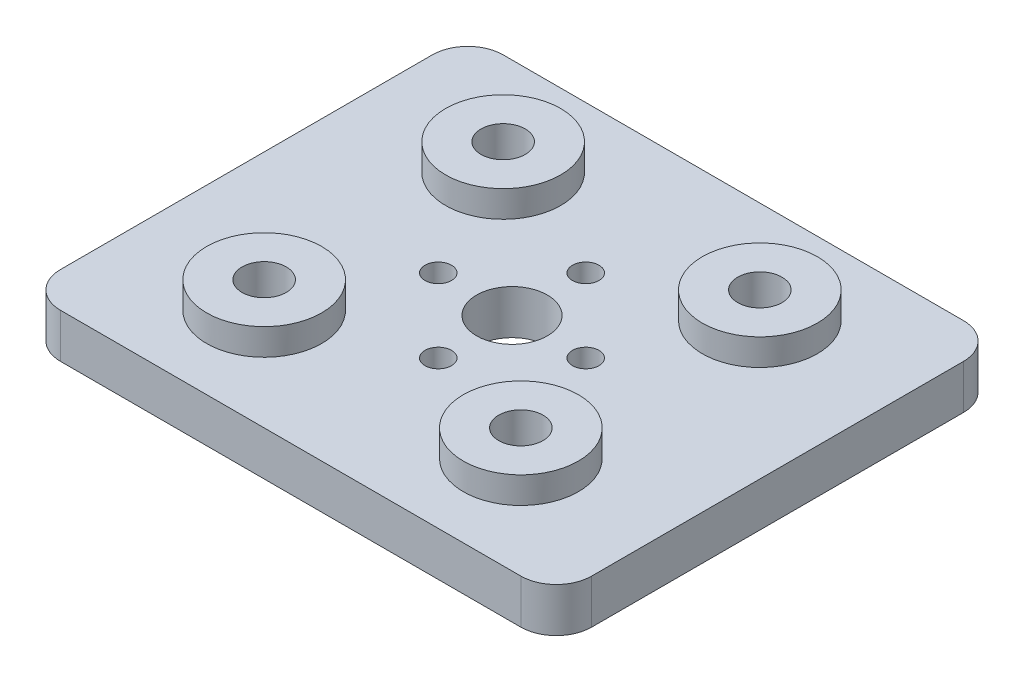
ISO-10303-21;
HEADER;
FILE_DESCRIPTION(('STEP AP214'),'2;1');
FILE_NAME('part.step','',(''),(''),'','','');
FILE_SCHEMA(('AUTOMOTIVE_DESIGN { 1 0 10303 214 1 1 1 1 }'));
ENDSEC;
DATA;
#1=APPLICATION_CONTEXT('core data for automotive mechanical design processes');
#2=APPLICATION_PROTOCOL_DEFINITION('international standard','automotive_design',2000,#1);
#3=PRODUCT_CONTEXT('',#1,'mechanical');
#4=PRODUCT('Part','Part','',(#3));
#5=PRODUCT_RELATED_PRODUCT_CATEGORY('part','',(#4));
#6=PRODUCT_DEFINITION_FORMATION('','',#4);
#7=PRODUCT_DEFINITION_CONTEXT('part definition',#1,'design');
#8=PRODUCT_DEFINITION('design','',#6,#7);
#9=PRODUCT_DEFINITION_SHAPE('','',#8);
#10=(LENGTH_UNIT() NAMED_UNIT(*) SI_UNIT(.MILLI.,.METRE.));
#11=(NAMED_UNIT(*) PLANE_ANGLE_UNIT() SI_UNIT($,.RADIAN.));
#12=(NAMED_UNIT(*) SI_UNIT($,.STERADIAN.) SOLID_ANGLE_UNIT());
#13=UNCERTAINTY_MEASURE_WITH_UNIT(LENGTH_MEASURE(1.E-05),#10,'distance_accuracy_value','');
#14=(GEOMETRIC_REPRESENTATION_CONTEXT(3) GLOBAL_UNCERTAINTY_ASSIGNED_CONTEXT((#13)) GLOBAL_UNIT_ASSIGNED_CONTEXT((#10,
#11,#12)) REPRESENTATION_CONTEXT('',''));
#15=CARTESIAN_POINT('',(0.,0.,0.));
#16=DIRECTION('',(0.,0.,1.));
#17=DIRECTION('',(1.,0.,0.));
#18=AXIS2_PLACEMENT_3D('',#15,#16,#17);
#19=CARTESIAN_POINT('',(0.,5.,0.));
#20=DIRECTION('',(0.,-1.,0.));
#21=DIRECTION('',(0.,0.,-1.));
#22=AXIS2_PLACEMENT_3D('',#19,#20,#21);
#23=PLANE('',#22);
#24=CARTESIAN_POINT('',(4.76814036559839,5.,-16.297796233001));
#25=DIRECTION('',(0.,-1.,0.));
#26=DIRECTION('',(0.,0.,-1.));
#27=AXIS2_PLACEMENT_3D('',#24,#25,#26);
#28=CIRCLE('',#27,6.50000000000001);
#29=CARTESIAN_POINT('',(4.76814036559839,5.,-22.797796233001));
#30=VERTEX_POINT('',#29);
#31=EDGE_CURVE('E40',#30,#30,#28,.F.);
#32=ORIENTED_EDGE('',*,*,#31,.F.);
#33=EDGE_LOOP('',(#32));
#34=FACE_BOUND('',#33,.T.);
#35=CARTESIAN_POINT('',(33.7681403655984,5.,-16.297796233001));
#36=DIRECTION('',(0.,-1.,0.));
#37=DIRECTION('',(0.,0.,-1.));
#38=AXIS2_PLACEMENT_3D('',#35,#36,#37);
#39=CIRCLE('',#38,6.50000000000001);
#40=CARTESIAN_POINT('',(33.7681403655984,5.,-22.797796233001));
#41=VERTEX_POINT('',#40);
#42=EDGE_CURVE('E163',#41,#41,#39,.F.);
#43=ORIENTED_EDGE('',*,*,#42,.F.);
#44=EDGE_LOOP('',(#43));
#45=FACE_BOUND('',#44,.T.);
#46=DIRECTION('',(0.,0.,1.));
#47=VECTOR('',#46,1.);
#48=CARTESIAN_POINT('',(-10.7318596344016,5.,22.2022037669994));
#49=LINE('',#48,#47);
#50=CARTESIAN_POINT('',(-10.7318596344016,5.,-23.7977962330006));
#51=VERTEX_POINT('',#50);
#52=CARTESIAN_POINT('',(-10.7318596344016,5.,18.2022037669994));
#53=VERTEX_POINT('',#52);
#54=EDGE_CURVE('E137',#51,#53,#49,.T.);
#55=ORIENTED_EDGE('',*,*,#54,.T.);
#56=CARTESIAN_POINT('',(-6.73185963440161,5.,18.2022037669994));
#57=DIRECTION('',(0.,-1.,0.));
#58=DIRECTION('',(0.,0.,-1.));
#59=AXIS2_PLACEMENT_3D('',#56,#57,#58);
#60=CIRCLE('',#59,4.);
#61=CARTESIAN_POINT('',(-6.73185963440161,5.,22.2022037669994));
#62=VERTEX_POINT('',#61);
#63=EDGE_CURVE('E152',#53,#62,#60,.F.);
#64=ORIENTED_EDGE('',*,*,#63,.T.);
#65=DIRECTION('',(1.,0.,0.));
#66=VECTOR('',#65,1.);
#67=CARTESIAN_POINT('',(-10.7318596344016,5.,22.2022037669994));
#68=LINE('',#67,#66);
#69=CARTESIAN_POINT('',(45.2681403655984,5.,22.2022037669994));
#70=VERTEX_POINT('',#69);
#71=EDGE_CURVE('E119',#62,#70,#68,.T.);
#72=ORIENTED_EDGE('',*,*,#71,.T.);
#73=CARTESIAN_POINT('',(45.2681403655984,5.,18.2022037669994));
#74=DIRECTION('',(0.,-1.,0.));
#75=DIRECTION('',(0.,0.,-1.));
#76=AXIS2_PLACEMENT_3D('',#73,#74,#75);
#77=CIRCLE('',#76,4.);
#78=CARTESIAN_POINT('',(49.2681403655984,5.,18.2022037669994));
#79=VERTEX_POINT('',#78);
#80=EDGE_CURVE('E150',#70,#79,#77,.F.);
#81=ORIENTED_EDGE('',*,*,#80,.T.);
#82=DIRECTION('',(0.,0.,-1.));
#83=VECTOR('',#82,1.);
#84=CARTESIAN_POINT('',(49.2681403655984,5.,22.2022037669994));
#85=LINE('',#84,#83);
#86=CARTESIAN_POINT('',(49.2681403655984,5.,-23.7977962330006));
#87=VERTEX_POINT('',#86);
#88=EDGE_CURVE('E308',#79,#87,#85,.T.);
#89=ORIENTED_EDGE('',*,*,#88,.T.);
#90=CARTESIAN_POINT('',(45.2681403655984,5.,-23.7977962330006));
#91=DIRECTION('',(0.,-1.,0.));
#92=DIRECTION('',(0.,0.,-1.));
#93=AXIS2_PLACEMENT_3D('',#90,#91,#92);
#94=CIRCLE('',#93,4.);
#95=CARTESIAN_POINT('',(45.2681403655984,5.,-27.7977962330006));
#96=VERTEX_POINT('',#95);
#97=EDGE_CURVE('E54',#87,#96,#94,.F.);
#98=ORIENTED_EDGE('',*,*,#97,.T.);
#99=DIRECTION('',(-1.,0.,0.));
#100=VECTOR('',#99,1.);
#101=CARTESIAN_POINT('',(-10.7318596344016,5.,-27.7977962330006));
#102=LINE('',#101,#100);
#103=CARTESIAN_POINT('',(-6.73185963440161,5.,-27.7977962330006));
#104=VERTEX_POINT('',#103);
#105=EDGE_CURVE('E138',#96,#104,#102,.T.);
#106=ORIENTED_EDGE('',*,*,#105,.T.);
#107=CARTESIAN_POINT('',(-6.73185963440161,5.,-23.7977962330006));
#108=DIRECTION('',(0.,-1.,0.));
#109=DIRECTION('',(0.,0.,-1.));
#110=AXIS2_PLACEMENT_3D('',#107,#108,#109);
#111=CIRCLE('',#110,4.);
#112=EDGE_CURVE('E147',#104,#51,#111,.F.);
#113=ORIENTED_EDGE('',*,*,#112,.T.);
#114=EDGE_LOOP('',(#55,#64,#72,#81,#89,#98,#106,#113));
#115=FACE_BOUND('',#114,.T.);
#116=CARTESIAN_POINT('',(19.2681403655984,5.,-2.79779623300059));
#117=DIRECTION('',(0.,1.,0.));
#118=DIRECTION('',(0.,0.,1.));
#119=AXIS2_PLACEMENT_3D('',#116,#117,#118);
#120=CIRCLE('',#119,4.00000000000001);
#121=CARTESIAN_POINT('',(19.2681403655984,5.,1.20220376699941));
#122=VERTEX_POINT('',#121);
#123=EDGE_CURVE('E132',#122,#122,#120,.T.);
#124=ORIENTED_EDGE('',*,*,#123,.F.);
#125=EDGE_LOOP('',(#124));
#126=FACE_BOUND('',#125,.T.);
#127=CARTESIAN_POINT('',(10.9381403655984,5.,-2.79779623300059));
#128=DIRECTION('',(0.,1.,0.));
#129=DIRECTION('',(0.,0.,1.));
#130=AXIS2_PLACEMENT_3D('',#127,#128,#129);
#131=CIRCLE('',#130,1.5);
#132=CARTESIAN_POINT('',(10.9381403655984,5.,-1.29779623300059));
#133=VERTEX_POINT('',#132);
#134=EDGE_CURVE('E186',#133,#133,#131,.T.);
#135=ORIENTED_EDGE('',*,*,#134,.F.);
#136=EDGE_LOOP('',(#135));
#137=FACE_BOUND('',#136,.T.);
#138=CARTESIAN_POINT('',(19.2681403655984,5.,-11.1277962330006));
#139=DIRECTION('',(0.,1.,0.));
#140=DIRECTION('',(0.,0.,1.));
#141=AXIS2_PLACEMENT_3D('',#138,#139,#140);
#142=CIRCLE('',#141,1.5);
#143=CARTESIAN_POINT('',(19.2681403655984,5.,-9.62779623300059));
#144=VERTEX_POINT('',#143);
#145=EDGE_CURVE('E190',#144,#144,#142,.T.);
#146=ORIENTED_EDGE('',*,*,#145,.F.);
#147=EDGE_LOOP('',(#146));
#148=FACE_BOUND('',#147,.T.);
#149=CARTESIAN_POINT('',(27.5981403655984,5.,-2.79779623300053));
#150=DIRECTION('',(0.,1.,0.));
#151=DIRECTION('',(0.,0.,1.));
#152=AXIS2_PLACEMENT_3D('',#149,#150,#151);
#153=CIRCLE('',#152,1.5);
#154=CARTESIAN_POINT('',(27.5981403655984,5.,-1.29779623300053));
#155=VERTEX_POINT('',#154);
#156=EDGE_CURVE('E194',#155,#155,#153,.T.);
#157=ORIENTED_EDGE('',*,*,#156,.F.);
#158=EDGE_LOOP('',(#157));
#159=FACE_BOUND('',#158,.T.);
#160=CARTESIAN_POINT('',(19.2681403655983,5.,5.53220376699941));
#161=DIRECTION('',(0.,1.,0.));
#162=DIRECTION('',(0.,0.,1.));
#163=AXIS2_PLACEMENT_3D('',#160,#161,#162);
#164=CIRCLE('',#163,1.5);
#165=CARTESIAN_POINT('',(19.2681403655983,5.,7.03220376699941));
#166=VERTEX_POINT('',#165);
#167=EDGE_CURVE('E198',#166,#166,#164,.T.);
#168=ORIENTED_EDGE('',*,*,#167,.F.);
#169=EDGE_LOOP('',(#168));
#170=FACE_BOUND('',#169,.T.);
#171=CARTESIAN_POINT('',(33.7681403655984,5.,10.702203766999));
#172=DIRECTION('',(0.,-1.,0.));
#173=DIRECTION('',(0.,0.,-1.));
#174=AXIS2_PLACEMENT_3D('',#171,#172,#173);
#175=CIRCLE('',#174,6.50000000000001);
#176=CARTESIAN_POINT('',(33.7681403655984,5.,4.20220376699899));
#177=VERTEX_POINT('',#176);
#178=EDGE_CURVE('E166',#177,#177,#175,.F.);
#179=ORIENTED_EDGE('',*,*,#178,.F.);
#180=EDGE_LOOP('',(#179));
#181=FACE_BOUND('',#180,.T.);
#182=CARTESIAN_POINT('',(4.76814036559839,5.,10.702203766999));
#183=DIRECTION('',(0.,-1.,0.));
#184=DIRECTION('',(0.,0.,-1.));
#185=AXIS2_PLACEMENT_3D('',#182,#183,#184);
#186=CIRCLE('',#185,6.50000000000001);
#187=CARTESIAN_POINT('',(4.76814036559839,5.,4.20220376699899));
#188=VERTEX_POINT('',#187);
#189=EDGE_CURVE('E11',#188,#188,#186,.F.);
#190=ORIENTED_EDGE('',*,*,#189,.F.);
#191=EDGE_LOOP('',(#190));
#192=FACE_BOUND('',#191,.T.);
#193=ADVANCED_FACE('F32',(#34,#45,#115,#126,#137,#148,#159,#170,#181,#192),#23,.F.);
#194=CARTESIAN_POINT('',(0.,0.,0.));
#195=DIRECTION('',(0.,-1.,0.));
#196=DIRECTION('',(0.,0.,-1.));
#197=AXIS2_PLACEMENT_3D('',#194,#195,#196);
#198=PLANE('',#197);
#199=CARTESIAN_POINT('',(33.7681403655984,0.,-16.297796233001));
#200=DIRECTION('',(0.,1.,0.));
#201=DIRECTION('',(0.,0.,1.));
#202=AXIS2_PLACEMENT_3D('',#199,#200,#201);
#203=CIRCLE('',#202,2.5);
#204=CARTESIAN_POINT('',(33.7681403655984,0.,-13.797796233001));
#205=VERTEX_POINT('',#204);
#206=EDGE_CURVE('E338',#205,#205,#203,.T.);
#207=ORIENTED_EDGE('',*,*,#206,.T.);
#208=EDGE_LOOP('',(#207));
#209=FACE_BOUND('',#208,.T.);
#210=CARTESIAN_POINT('',(33.7681403655987,0.,10.702203766999));
#211=DIRECTION('',(0.,1.,0.));
#212=DIRECTION('',(0.,0.,1.));
#213=AXIS2_PLACEMENT_3D('',#210,#211,#212);
#214=CIRCLE('',#213,2.5);
#215=CARTESIAN_POINT('',(33.7681403655987,0.,13.202203766999));
#216=VERTEX_POINT('',#215);
#217=EDGE_CURVE('E342',#216,#216,#214,.T.);
#218=ORIENTED_EDGE('',*,*,#217,.T.);
#219=EDGE_LOOP('',(#218));
#220=FACE_BOUND('',#219,.T.);
#221=CARTESIAN_POINT('',(4.76814036559867,0.,10.7022037669994));
#222=DIRECTION('',(0.,1.,0.));
#223=DIRECTION('',(0.,0.,1.));
#224=AXIS2_PLACEMENT_3D('',#221,#222,#223);
#225=CIRCLE('',#224,2.5);
#226=CARTESIAN_POINT('',(4.76814036559867,0.,13.2022037669994));
#227=VERTEX_POINT('',#226);
#228=EDGE_CURVE('E339',#227,#227,#225,.T.);
#229=ORIENTED_EDGE('',*,*,#228,.T.);
#230=EDGE_LOOP('',(#229));
#231=FACE_BOUND('',#230,.T.);
#232=CARTESIAN_POINT('',(4.76814036559839,0.,-16.2977962330006));
#233=DIRECTION('',(0.,1.,0.));
#234=DIRECTION('',(0.,0.,1.));
#235=AXIS2_PLACEMENT_3D('',#232,#233,#234);
#236=CIRCLE('',#235,2.5);
#237=CARTESIAN_POINT('',(4.76814036559839,0.,-13.7977962330006));
#238=VERTEX_POINT('',#237);
#239=EDGE_CURVE('E334',#238,#238,#236,.T.);
#240=ORIENTED_EDGE('',*,*,#239,.T.);
#241=EDGE_LOOP('',(#240));
#242=FACE_BOUND('',#241,.T.);
#243=CARTESIAN_POINT('',(27.5981403655984,0.,-2.79779623300053));
#244=DIRECTION('',(0.,1.,0.));
#245=DIRECTION('',(0.,0.,1.));
#246=AXIS2_PLACEMENT_3D('',#243,#244,#245);
#247=CIRCLE('',#246,1.5);
#248=CARTESIAN_POINT('',(27.5981403655984,0.,-1.29779623300053));
#249=VERTEX_POINT('',#248);
#250=EDGE_CURVE('E327',#249,#249,#247,.T.);
#251=ORIENTED_EDGE('',*,*,#250,.T.);
#252=EDGE_LOOP('',(#251));
#253=FACE_BOUND('',#252,.T.);
#254=CARTESIAN_POINT('',(10.9381403655984,0.,-2.79779623300059));
#255=DIRECTION('',(0.,1.,0.));
#256=DIRECTION('',(0.,0.,1.));
#257=AXIS2_PLACEMENT_3D('',#254,#255,#256);
#258=CIRCLE('',#257,1.5);
#259=CARTESIAN_POINT('',(10.9381403655984,0.,-1.29779623300059));
#260=VERTEX_POINT('',#259);
#261=EDGE_CURVE('E319',#260,#260,#258,.T.);
#262=ORIENTED_EDGE('',*,*,#261,.T.);
#263=EDGE_LOOP('',(#262));
#264=FACE_BOUND('',#263,.T.);
#265=DIRECTION('',(1.,0.,0.));
#266=VECTOR('',#265,1.);
#267=CARTESIAN_POINT('',(-10.7318596344016,0.,22.2022037669994));
#268=LINE('',#267,#266);
#269=CARTESIAN_POINT('',(-6.73185963440161,0.,22.2022037669994));
#270=VERTEX_POINT('',#269);
#271=CARTESIAN_POINT('',(45.2681403655984,0.,22.2022037669994));
#272=VERTEX_POINT('',#271);
#273=EDGE_CURVE('E116',#270,#272,#268,.T.);
#274=ORIENTED_EDGE('',*,*,#273,.F.);
#275=CARTESIAN_POINT('',(-6.73185963440161,0.,18.2022037669994));
#276=DIRECTION('',(0.,-1.,0.));
#277=DIRECTION('',(0.,0.,-1.));
#278=AXIS2_PLACEMENT_3D('',#275,#276,#277);
#279=CIRCLE('',#278,4.);
#280=CARTESIAN_POINT('',(-10.7318596344016,0.,18.2022037669994));
#281=VERTEX_POINT('',#280);
#282=EDGE_CURVE('E99',#270,#281,#279,.T.);
#283=ORIENTED_EDGE('',*,*,#282,.T.);
#284=DIRECTION('',(0.,0.,1.));
#285=VECTOR('',#284,1.);
#286=CARTESIAN_POINT('',(-10.7318596344016,0.,22.2022037669994));
#287=LINE('',#286,#285);
#288=CARTESIAN_POINT('',(-10.7318596344016,0.,-23.7977962330006));
#289=VERTEX_POINT('',#288);
#290=EDGE_CURVE('E127',#289,#281,#287,.T.);
#291=ORIENTED_EDGE('',*,*,#290,.F.);
#292=CARTESIAN_POINT('',(-6.73185963440161,0.,-23.7977962330006));
#293=DIRECTION('',(0.,-1.,0.));
#294=DIRECTION('',(0.,0.,-1.));
#295=AXIS2_PLACEMENT_3D('',#292,#293,#294);
#296=CIRCLE('',#295,4.);
#297=CARTESIAN_POINT('',(-6.73185963440161,0.,-27.7977962330006));
#298=VERTEX_POINT('',#297);
#299=EDGE_CURVE('E120',#289,#298,#296,.T.);
#300=ORIENTED_EDGE('',*,*,#299,.T.);
#301=DIRECTION('',(-1.,0.,0.));
#302=VECTOR('',#301,1.);
#303=CARTESIAN_POINT('',(-10.7318596344016,0.,-27.7977962330006));
#304=LINE('',#303,#302);
#305=CARTESIAN_POINT('',(45.2681403655984,0.,-27.7977962330006));
#306=VERTEX_POINT('',#305);
#307=EDGE_CURVE('E130',#306,#298,#304,.T.);
#308=ORIENTED_EDGE('',*,*,#307,.F.);
#309=CARTESIAN_POINT('',(45.2681403655984,0.,-23.7977962330006));
#310=DIRECTION('',(0.,-1.,0.));
#311=DIRECTION('',(0.,0.,-1.));
#312=AXIS2_PLACEMENT_3D('',#309,#310,#311);
#313=CIRCLE('',#312,4.);
#314=CARTESIAN_POINT('',(49.2681403655984,0.,-23.7977962330006));
#315=VERTEX_POINT('',#314);
#316=EDGE_CURVE('E141',#306,#315,#313,.T.);
#317=ORIENTED_EDGE('',*,*,#316,.T.);
#318=DIRECTION('',(0.,0.,-1.));
#319=VECTOR('',#318,1.);
#320=CARTESIAN_POINT('',(49.2681403655984,0.,22.2022037669994));
#321=LINE('',#320,#319);
#322=CARTESIAN_POINT('',(49.2681403655984,0.,18.2022037669994));
#323=VERTEX_POINT('',#322);
#324=EDGE_CURVE('E126',#323,#315,#321,.T.);
#325=ORIENTED_EDGE('',*,*,#324,.F.);
#326=CARTESIAN_POINT('',(45.2681403655984,0.,18.2022037669994));
#327=DIRECTION('',(0.,-1.,0.));
#328=DIRECTION('',(0.,0.,-1.));
#329=AXIS2_PLACEMENT_3D('',#326,#327,#328);
#330=CIRCLE('',#329,4.);
#331=EDGE_CURVE('E110',#323,#272,#330,.T.);
#332=ORIENTED_EDGE('',*,*,#331,.T.);
#333=EDGE_LOOP('',(#274,#283,#291,#300,#308,#317,#325,#332));
#334=FACE_BOUND('',#333,.T.);
#335=CARTESIAN_POINT('',(19.2681403655984,0.,-2.79779623300059));
#336=DIRECTION('',(0.,1.,0.));
#337=DIRECTION('',(0.,0.,1.));
#338=AXIS2_PLACEMENT_3D('',#335,#336,#337);
#339=CIRCLE('',#338,4.00000000000001);
#340=CARTESIAN_POINT('',(19.2681403655984,0.,1.20220376699941));
#341=VERTEX_POINT('',#340);
#342=EDGE_CURVE('E311',#341,#341,#339,.T.);
#343=ORIENTED_EDGE('',*,*,#342,.T.);
#344=EDGE_LOOP('',(#343));
#345=FACE_BOUND('',#344,.T.);
#346=CARTESIAN_POINT('',(19.2681403655984,0.,-11.1277962330006));
#347=DIRECTION('',(0.,1.,0.));
#348=DIRECTION('',(0.,0.,1.));
#349=AXIS2_PLACEMENT_3D('',#346,#347,#348);
#350=CIRCLE('',#349,1.5);
#351=CARTESIAN_POINT('',(19.2681403655984,0.,-9.62779623300059));
#352=VERTEX_POINT('',#351);
#353=EDGE_CURVE('E323',#352,#352,#350,.T.);
#354=ORIENTED_EDGE('',*,*,#353,.T.);
#355=EDGE_LOOP('',(#354));
#356=FACE_BOUND('',#355,.T.);
#357=CARTESIAN_POINT('',(19.2681403655983,0.,5.53220376699941));
#358=DIRECTION('',(0.,1.,0.));
#359=DIRECTION('',(0.,0.,1.));
#360=AXIS2_PLACEMENT_3D('',#357,#358,#359);
#361=CIRCLE('',#360,1.5);
#362=CARTESIAN_POINT('',(19.2681403655983,0.,7.03220376699941));
#363=VERTEX_POINT('',#362);
#364=EDGE_CURVE('E331',#363,#363,#361,.T.);
#365=ORIENTED_EDGE('',*,*,#364,.T.);
#366=EDGE_LOOP('',(#365));
#367=FACE_BOUND('',#366,.T.);
#368=ADVANCED_FACE('F123',(#209,#220,#231,#242,#253,#264,#334,#345,#356,#367),#198,.T.);
#369=CARTESIAN_POINT('',(-10.7318596344016,5.,22.2022037669994));
#370=DIRECTION('',(1.,0.,0.));
#371=DIRECTION('',(0.,0.,-1.));
#372=AXIS2_PLACEMENT_3D('',#369,#370,#371);
#373=PLANE('',#372);
#374=ORIENTED_EDGE('',*,*,#290,.T.);
#375=DIRECTION('',(0.,-1.,0.));
#376=VECTOR('',#375,1.);
#377=CARTESIAN_POINT('',(-10.7318596344016,5.,18.2022037669994));
#378=LINE('',#377,#376);
#379=EDGE_CURVE('E104',#281,#53,#378,.F.);
#380=ORIENTED_EDGE('',*,*,#379,.T.);
#381=ORIENTED_EDGE('',*,*,#54,.F.);
#382=DIRECTION('',(0.,-1.,0.));
#383=VECTOR('',#382,1.);
#384=CARTESIAN_POINT('',(-10.7318596344016,5.,-23.7977962330006));
#385=LINE('',#384,#383);
#386=EDGE_CURVE('E109',#51,#289,#385,.T.);
#387=ORIENTED_EDGE('',*,*,#386,.T.);
#388=EDGE_LOOP('',(#374,#380,#381,#387));
#389=FACE_BOUND('',#388,.T.);
#390=ADVANCED_FACE('F277',(#389),#373,.F.);
#391=CARTESIAN_POINT('',(-10.7318596344016,5.,22.2022037669994));
#392=DIRECTION('',(0.,0.,-1.));
#393=DIRECTION('',(-1.,0.,0.));
#394=AXIS2_PLACEMENT_3D('',#391,#392,#393);
#395=PLANE('',#394);
#396=ORIENTED_EDGE('',*,*,#71,.F.);
#397=DIRECTION('',(0.,-1.,0.));
#398=VECTOR('',#397,1.);
#399=CARTESIAN_POINT('',(-6.73185963440161,5.,22.2022037669994));
#400=LINE('',#399,#398);
#401=EDGE_CURVE('E103',#62,#270,#400,.T.);
#402=ORIENTED_EDGE('',*,*,#401,.T.);
#403=ORIENTED_EDGE('',*,*,#273,.T.);
#404=DIRECTION('',(0.,-1.,0.));
#405=VECTOR('',#404,1.);
#406=CARTESIAN_POINT('',(45.2681403655984,5.,22.2022037669994));
#407=LINE('',#406,#405);
#408=EDGE_CURVE('E121',#272,#70,#407,.F.);
#409=ORIENTED_EDGE('',*,*,#408,.T.);
#410=EDGE_LOOP('',(#396,#402,#403,#409));
#411=FACE_BOUND('',#410,.T.);
#412=ADVANCED_FACE('F115',(#411),#395,.F.);
#413=CARTESIAN_POINT('',(49.2681403655984,5.,22.2022037669994));
#414=DIRECTION('',(-1.,0.,0.));
#415=DIRECTION('',(0.,0.,1.));
#416=AXIS2_PLACEMENT_3D('',#413,#414,#415);
#417=PLANE('',#416);
#418=ORIENTED_EDGE('',*,*,#88,.F.);
#419=DIRECTION('',(0.,-1.,0.));
#420=VECTOR('',#419,1.);
#421=CARTESIAN_POINT('',(49.2681403655984,5.,18.2022037669994));
#422=LINE('',#421,#420);
#423=EDGE_CURVE('E156',#79,#323,#422,.T.);
#424=ORIENTED_EDGE('',*,*,#423,.T.);
#425=ORIENTED_EDGE('',*,*,#324,.T.);
#426=DIRECTION('',(0.,-1.,0.));
#427=VECTOR('',#426,1.);
#428=CARTESIAN_POINT('',(49.2681403655984,5.,-23.7977962330006));
#429=LINE('',#428,#427);
#430=EDGE_CURVE('E154',#315,#87,#429,.F.);
#431=ORIENTED_EDGE('',*,*,#430,.T.);
#432=EDGE_LOOP('',(#418,#424,#425,#431));
#433=FACE_BOUND('',#432,.T.);
#434=ADVANCED_FACE('F281',(#433),#417,.F.);
#435=CARTESIAN_POINT('',(-10.7318596344016,5.,-27.7977962330006));
#436=DIRECTION('',(0.,0.,1.));
#437=DIRECTION('',(1.,0.,0.));
#438=AXIS2_PLACEMENT_3D('',#435,#436,#437);
#439=PLANE('',#438);
#440=ORIENTED_EDGE('',*,*,#105,.F.);
#441=DIRECTION('',(0.,-1.,0.));
#442=VECTOR('',#441,1.);
#443=CARTESIAN_POINT('',(45.2681403655984,5.,-27.7977962330006));
#444=LINE('',#443,#442);
#445=EDGE_CURVE('E160',#96,#306,#444,.T.);
#446=ORIENTED_EDGE('',*,*,#445,.T.);
#447=ORIENTED_EDGE('',*,*,#307,.T.);
#448=DIRECTION('',(0.,-1.,0.));
#449=VECTOR('',#448,1.);
#450=CARTESIAN_POINT('',(-6.73185963440161,5.,-27.7977962330006));
#451=LINE('',#450,#449);
#452=EDGE_CURVE('E47',#298,#104,#451,.F.);
#453=ORIENTED_EDGE('',*,*,#452,.T.);
#454=EDGE_LOOP('',(#440,#446,#447,#453));
#455=FACE_BOUND('',#454,.T.);
#456=ADVANCED_FACE('F272',(#455),#439,.F.);
#457=CARTESIAN_POINT('',(19.2681403655984,5.,-2.79779623300059));
#458=DIRECTION('',(0.,-1.,0.));
#459=DIRECTION('',(0.,0.,-1.));
#460=AXIS2_PLACEMENT_3D('',#457,#458,#459);
#461=CYLINDRICAL_SURFACE('',#460,4.00000000000001);
#462=ORIENTED_EDGE('',*,*,#123,.T.);
#463=EDGE_LOOP('',(#462));
#464=FACE_BOUND('',#463,.T.);
#465=ORIENTED_EDGE('',*,*,#342,.F.);
#466=EDGE_LOOP('',(#465));
#467=FACE_BOUND('',#466,.T.);
#468=ADVANCED_FACE('F269',(#464,#467),#461,.F.);
#469=CARTESIAN_POINT('',(10.9381403655984,5.,-2.79779623300059));
#470=DIRECTION('',(0.,-1.,0.));
#471=DIRECTION('',(0.,0.,-1.));
#472=AXIS2_PLACEMENT_3D('',#469,#470,#471);
#473=CYLINDRICAL_SURFACE('',#472,1.5);
#474=ORIENTED_EDGE('',*,*,#134,.T.);
#475=EDGE_LOOP('',(#474));
#476=FACE_BOUND('',#475,.T.);
#477=ORIENTED_EDGE('',*,*,#261,.F.);
#478=EDGE_LOOP('',(#477));
#479=FACE_BOUND('',#478,.T.);
#480=ADVANCED_FACE('F265',(#476,#479),#473,.F.);
#481=CARTESIAN_POINT('',(19.2681403655984,5.,-11.1277962330006));
#482=DIRECTION('',(0.,-1.,0.));
#483=DIRECTION('',(0.,0.,-1.));
#484=AXIS2_PLACEMENT_3D('',#481,#482,#483);
#485=CYLINDRICAL_SURFACE('',#484,1.5);
#486=ORIENTED_EDGE('',*,*,#145,.T.);
#487=EDGE_LOOP('',(#486));
#488=FACE_BOUND('',#487,.T.);
#489=ORIENTED_EDGE('',*,*,#353,.F.);
#490=EDGE_LOOP('',(#489));
#491=FACE_BOUND('',#490,.T.);
#492=ADVANCED_FACE('F261',(#488,#491),#485,.F.);
#493=CARTESIAN_POINT('',(27.5981403655984,5.,-2.79779623300053));
#494=DIRECTION('',(0.,-1.,0.));
#495=DIRECTION('',(0.,0.,-1.));
#496=AXIS2_PLACEMENT_3D('',#493,#494,#495);
#497=CYLINDRICAL_SURFACE('',#496,1.5);
#498=ORIENTED_EDGE('',*,*,#156,.T.);
#499=EDGE_LOOP('',(#498));
#500=FACE_BOUND('',#499,.T.);
#501=ORIENTED_EDGE('',*,*,#250,.F.);
#502=EDGE_LOOP('',(#501));
#503=FACE_BOUND('',#502,.T.);
#504=ADVANCED_FACE('F257',(#500,#503),#497,.F.);
#505=CARTESIAN_POINT('',(19.2681403655983,5.,5.53220376699941));
#506=DIRECTION('',(0.,-1.,0.));
#507=DIRECTION('',(0.,0.,-1.));
#508=AXIS2_PLACEMENT_3D('',#505,#506,#507);
#509=CYLINDRICAL_SURFACE('',#508,1.5);
#510=ORIENTED_EDGE('',*,*,#167,.T.);
#511=EDGE_LOOP('',(#510));
#512=FACE_BOUND('',#511,.T.);
#513=ORIENTED_EDGE('',*,*,#364,.F.);
#514=EDGE_LOOP('',(#513));
#515=FACE_BOUND('',#514,.T.);
#516=ADVANCED_FACE('F253',(#512,#515),#509,.F.);
#517=CARTESIAN_POINT('',(4.76814036559839,0.,-16.2977962330006));
#518=DIRECTION('',(0.,1.,0.));
#519=DIRECTION('',(0.,0.,1.));
#520=AXIS2_PLACEMENT_3D('',#517,#518,#519);
#521=CYLINDRICAL_SURFACE('',#520,2.5);
#522=ORIENTED_EDGE('',*,*,#239,.F.);
#523=EDGE_LOOP('',(#522));
#524=FACE_BOUND('',#523,.T.);
#525=CARTESIAN_POINT('',(4.76814036559839,8.,-16.297796233001));
#526=DIRECTION('',(0.,1.,0.));
#527=DIRECTION('',(0.,0.,1.));
#528=AXIS2_PLACEMENT_3D('',#525,#526,#527);
#529=CIRCLE('',#528,2.5);
#530=CARTESIAN_POINT('',(4.76814036559839,8.,-13.797796233001));
#531=VERTEX_POINT('',#530);
#532=EDGE_CURVE('E362',#531,#531,#529,.T.);
#533=ORIENTED_EDGE('',*,*,#532,.T.);
#534=EDGE_LOOP('',(#533));
#535=FACE_BOUND('',#534,.T.);
#536=ADVANCED_FACE('F249',(#524,#535),#521,.F.);
#537=CARTESIAN_POINT('',(4.76814036559867,0.,10.7022037669994));
#538=DIRECTION('',(0.,1.,0.));
#539=DIRECTION('',(0.,0.,1.));
#540=AXIS2_PLACEMENT_3D('',#537,#538,#539);
#541=CYLINDRICAL_SURFACE('',#540,2.5);
#542=ORIENTED_EDGE('',*,*,#228,.F.);
#543=EDGE_LOOP('',(#542));
#544=FACE_BOUND('',#543,.T.);
#545=CARTESIAN_POINT('',(4.76814036559839,8.,10.702203766999));
#546=DIRECTION('',(0.,1.,0.));
#547=DIRECTION('',(0.,0.,1.));
#548=AXIS2_PLACEMENT_3D('',#545,#546,#547);
#549=CIRCLE('',#548,2.5);
#550=CARTESIAN_POINT('',(4.76814036559839,8.,13.202203766999));
#551=VERTEX_POINT('',#550);
#552=EDGE_CURVE('E368',#551,#551,#549,.T.);
#553=ORIENTED_EDGE('',*,*,#552,.T.);
#554=EDGE_LOOP('',(#553));
#555=FACE_BOUND('',#554,.T.);
#556=ADVANCED_FACE('F245',(#544,#555),#541,.F.);
#557=CARTESIAN_POINT('',(33.7681403655987,0.,10.702203766999));
#558=DIRECTION('',(0.,1.,0.));
#559=DIRECTION('',(0.,0.,1.));
#560=AXIS2_PLACEMENT_3D('',#557,#558,#559);
#561=CYLINDRICAL_SURFACE('',#560,2.5);
#562=ORIENTED_EDGE('',*,*,#217,.F.);
#563=EDGE_LOOP('',(#562));
#564=FACE_BOUND('',#563,.T.);
#565=CARTESIAN_POINT('',(33.7681403655984,8.,10.702203766999));
#566=DIRECTION('',(0.,1.,0.));
#567=DIRECTION('',(0.,0.,1.));
#568=AXIS2_PLACEMENT_3D('',#565,#566,#567);
#569=CIRCLE('',#568,2.5);
#570=CARTESIAN_POINT('',(33.7681403655984,8.,13.202203766999));
#571=VERTEX_POINT('',#570);
#572=EDGE_CURVE('E356',#571,#571,#569,.T.);
#573=ORIENTED_EDGE('',*,*,#572,.T.);
#574=EDGE_LOOP('',(#573));
#575=FACE_BOUND('',#574,.T.);
#576=ADVANCED_FACE('F241',(#564,#575),#561,.F.);
#577=CARTESIAN_POINT('',(33.7681403655984,0.,-16.297796233001));
#578=DIRECTION('',(0.,1.,0.));
#579=DIRECTION('',(0.,0.,1.));
#580=AXIS2_PLACEMENT_3D('',#577,#578,#579);
#581=CYLINDRICAL_SURFACE('',#580,2.5);
#582=ORIENTED_EDGE('',*,*,#206,.F.);
#583=EDGE_LOOP('',(#582));
#584=FACE_BOUND('',#583,.T.);
#585=CARTESIAN_POINT('',(33.7681403655984,8.,-16.297796233001));
#586=DIRECTION('',(0.,1.,0.));
#587=DIRECTION('',(0.,0.,1.));
#588=AXIS2_PLACEMENT_3D('',#585,#586,#587);
#589=CIRCLE('',#588,2.5);
#590=CARTESIAN_POINT('',(33.7681403655984,8.,-13.797796233001));
#591=VERTEX_POINT('',#590);
#592=EDGE_CURVE('E350',#591,#591,#589,.T.);
#593=ORIENTED_EDGE('',*,*,#592,.T.);
#594=EDGE_LOOP('',(#593));
#595=FACE_BOUND('',#594,.T.);
#596=ADVANCED_FACE('F238',(#584,#595),#581,.F.);
#597=CARTESIAN_POINT('',(-6.73185963440161,5.,18.2022037669994));
#598=DIRECTION('',(0.,-1.,0.));
#599=DIRECTION('',(0.,0.,-1.));
#600=AXIS2_PLACEMENT_3D('',#597,#598,#599);
#601=CYLINDRICAL_SURFACE('',#600,4.);
#602=ORIENTED_EDGE('',*,*,#63,.F.);
#603=ORIENTED_EDGE('',*,*,#379,.F.);
#604=ORIENTED_EDGE('',*,*,#282,.F.);
#605=ORIENTED_EDGE('',*,*,#401,.F.);
#606=EDGE_LOOP('',(#602,#603,#604,#605));
#607=FACE_BOUND('',#606,.T.);
#608=ADVANCED_FACE('F102',(#607),#601,.T.);
#609=CARTESIAN_POINT('',(45.2681403655984,5.,18.2022037669994));
#610=DIRECTION('',(0.,-1.,0.));
#611=DIRECTION('',(0.,0.,-1.));
#612=AXIS2_PLACEMENT_3D('',#609,#610,#611);
#613=CYLINDRICAL_SURFACE('',#612,4.);
#614=ORIENTED_EDGE('',*,*,#80,.F.);
#615=ORIENTED_EDGE('',*,*,#408,.F.);
#616=ORIENTED_EDGE('',*,*,#331,.F.);
#617=ORIENTED_EDGE('',*,*,#423,.F.);
#618=EDGE_LOOP('',(#614,#615,#616,#617));
#619=FACE_BOUND('',#618,.T.);
#620=ADVANCED_FACE('F292',(#619),#613,.T.);
#621=CARTESIAN_POINT('',(45.2681403655984,5.,-23.7977962330006));
#622=DIRECTION('',(0.,-1.,0.));
#623=DIRECTION('',(0.,0.,-1.));
#624=AXIS2_PLACEMENT_3D('',#621,#622,#623);
#625=CYLINDRICAL_SURFACE('',#624,4.);
#626=ORIENTED_EDGE('',*,*,#97,.F.);
#627=ORIENTED_EDGE('',*,*,#430,.F.);
#628=ORIENTED_EDGE('',*,*,#316,.F.);
#629=ORIENTED_EDGE('',*,*,#445,.F.);
#630=EDGE_LOOP('',(#626,#627,#628,#629));
#631=FACE_BOUND('',#630,.T.);
#632=ADVANCED_FACE('F294',(#631),#625,.T.);
#633=CARTESIAN_POINT('',(-6.73185963440161,5.,-23.7977962330006));
#634=DIRECTION('',(0.,-1.,0.));
#635=DIRECTION('',(0.,0.,-1.));
#636=AXIS2_PLACEMENT_3D('',#633,#634,#635);
#637=CYLINDRICAL_SURFACE('',#636,4.);
#638=ORIENTED_EDGE('',*,*,#112,.F.);
#639=ORIENTED_EDGE('',*,*,#452,.F.);
#640=ORIENTED_EDGE('',*,*,#299,.F.);
#641=ORIENTED_EDGE('',*,*,#386,.F.);
#642=EDGE_LOOP('',(#638,#639,#640,#641));
#643=FACE_BOUND('',#642,.T.);
#644=ADVANCED_FACE('F34',(#643),#637,.T.);
#645=CARTESIAN_POINT('',(33.7681403655984,8.,-16.297796233001));
#646=DIRECTION('',(0.,1.,0.));
#647=DIRECTION('',(0.,0.,1.));
#648=AXIS2_PLACEMENT_3D('',#645,#646,#647);
#649=PLANE('',#648);
#650=CARTESIAN_POINT('',(33.7681403655984,8.,-16.297796233001));
#651=DIRECTION('',(0.,1.,0.));
#652=DIRECTION('',(0.,0.,1.));
#653=AXIS2_PLACEMENT_3D('',#650,#651,#652);
#654=CIRCLE('',#653,6.50000000000001);
#655=CARTESIAN_POINT('',(33.7681403655984,8.,-9.79779623300099));
#656=VERTEX_POINT('',#655);
#657=EDGE_CURVE('E343',#656,#656,#654,.T.);
#658=ORIENTED_EDGE('',*,*,#657,.T.);
#659=EDGE_LOOP('',(#658));
#660=FACE_BOUND('',#659,.T.);
#661=ORIENTED_EDGE('',*,*,#592,.F.);
#662=EDGE_LOOP('',(#661));
#663=FACE_BOUND('',#662,.T.);
#664=ADVANCED_FACE('F231',(#660,#663),#649,.T.);
#665=CARTESIAN_POINT('',(33.7681403655984,8.,-16.297796233001));
#666=DIRECTION('',(0.,-1.,0.));
#667=DIRECTION('',(0.,0.,-1.));
#668=AXIS2_PLACEMENT_3D('',#665,#666,#667);
#669=CYLINDRICAL_SURFACE('',#668,6.50000000000001);
#670=ORIENTED_EDGE('',*,*,#657,.F.);
#671=EDGE_LOOP('',(#670));
#672=FACE_BOUND('',#671,.T.);
#673=ORIENTED_EDGE('',*,*,#42,.T.);
#674=EDGE_LOOP('',(#673));
#675=FACE_BOUND('',#674,.T.);
#676=ADVANCED_FACE('F226',(#672,#675),#669,.T.);
#677=CARTESIAN_POINT('',(33.7681403655984,8.,10.702203766999));
#678=DIRECTION('',(0.,1.,0.));
#679=DIRECTION('',(0.,0.,1.));
#680=AXIS2_PLACEMENT_3D('',#677,#678,#679);
#681=PLANE('',#680);
#682=CARTESIAN_POINT('',(33.7681403655984,8.,10.702203766999));
#683=DIRECTION('',(0.,1.,0.));
#684=DIRECTION('',(0.,0.,1.));
#685=AXIS2_PLACEMENT_3D('',#682,#683,#684);
#686=CIRCLE('',#685,6.50000000000001);
#687=CARTESIAN_POINT('',(33.7681403655984,8.,17.202203766999));
#688=VERTEX_POINT('',#687);
#689=EDGE_CURVE('E353',#688,#688,#686,.T.);
#690=ORIENTED_EDGE('',*,*,#689,.T.);
#691=EDGE_LOOP('',(#690));
#692=FACE_BOUND('',#691,.T.);
#693=ORIENTED_EDGE('',*,*,#572,.F.);
#694=EDGE_LOOP('',(#693));
#695=FACE_BOUND('',#694,.T.);
#696=ADVANCED_FACE('F223',(#692,#695),#681,.T.);
#697=CARTESIAN_POINT('',(33.7681403655984,8.,10.702203766999));
#698=DIRECTION('',(0.,-1.,0.));
#699=DIRECTION('',(0.,0.,-1.));
#700=AXIS2_PLACEMENT_3D('',#697,#698,#699);
#701=CYLINDRICAL_SURFACE('',#700,6.50000000000001);
#702=ORIENTED_EDGE('',*,*,#689,.F.);
#703=EDGE_LOOP('',(#702));
#704=FACE_BOUND('',#703,.T.);
#705=ORIENTED_EDGE('',*,*,#178,.T.);
#706=EDGE_LOOP('',(#705));
#707=FACE_BOUND('',#706,.T.);
#708=ADVANCED_FACE('F218',(#704,#707),#701,.T.);
#709=CARTESIAN_POINT('',(4.76814036559839,8.,-16.297796233001));
#710=DIRECTION('',(0.,1.,0.));
#711=DIRECTION('',(0.,0.,1.));
#712=AXIS2_PLACEMENT_3D('',#709,#710,#711);
#713=PLANE('',#712);
#714=CARTESIAN_POINT('',(4.76814036559839,8.,-16.297796233001));
#715=DIRECTION('',(0.,1.,0.));
#716=DIRECTION('',(0.,0.,1.));
#717=AXIS2_PLACEMENT_3D('',#714,#715,#716);
#718=CIRCLE('',#717,6.50000000000001);
#719=CARTESIAN_POINT('',(4.76814036559839,8.,-9.79779623300099));
#720=VERTEX_POINT('',#719);
#721=EDGE_CURVE('E359',#720,#720,#718,.T.);
#722=ORIENTED_EDGE('',*,*,#721,.T.);
#723=EDGE_LOOP('',(#722));
#724=FACE_BOUND('',#723,.T.);
#725=ORIENTED_EDGE('',*,*,#532,.F.);
#726=EDGE_LOOP('',(#725));
#727=FACE_BOUND('',#726,.T.);
#728=ADVANCED_FACE('F215',(#724,#727),#713,.T.);
#729=CARTESIAN_POINT('',(4.76814036559839,8.,-16.297796233001));
#730=DIRECTION('',(0.,-1.,0.));
#731=DIRECTION('',(0.,0.,-1.));
#732=AXIS2_PLACEMENT_3D('',#729,#730,#731);
#733=CYLINDRICAL_SURFACE('',#732,6.50000000000001);
#734=ORIENTED_EDGE('',*,*,#721,.F.);
#735=EDGE_LOOP('',(#734));
#736=FACE_BOUND('',#735,.T.);
#737=ORIENTED_EDGE('',*,*,#31,.T.);
#738=EDGE_LOOP('',(#737));
#739=FACE_BOUND('',#738,.T.);
#740=ADVANCED_FACE('F171',(#736,#739),#733,.T.);
#741=CARTESIAN_POINT('',(4.76814036559839,8.,10.702203766999));
#742=DIRECTION('',(0.,1.,0.));
#743=DIRECTION('',(0.,0.,1.));
#744=AXIS2_PLACEMENT_3D('',#741,#742,#743);
#745=PLANE('',#744);
#746=CARTESIAN_POINT('',(4.76814036559839,8.,10.702203766999));
#747=DIRECTION('',(0.,1.,0.));
#748=DIRECTION('',(0.,0.,1.));
#749=AXIS2_PLACEMENT_3D('',#746,#747,#748);
#750=CIRCLE('',#749,6.50000000000001);
#751=CARTESIAN_POINT('',(4.76814036559839,8.,17.202203766999));
#752=VERTEX_POINT('',#751);
#753=EDGE_CURVE('E365',#752,#752,#750,.T.);
#754=ORIENTED_EDGE('',*,*,#753,.T.);
#755=EDGE_LOOP('',(#754));
#756=FACE_BOUND('',#755,.T.);
#757=ORIENTED_EDGE('',*,*,#552,.F.);
#758=EDGE_LOOP('',(#757));
#759=FACE_BOUND('',#758,.T.);
#760=ADVANCED_FACE('F205',(#756,#759),#745,.T.);
#761=CARTESIAN_POINT('',(4.76814036559839,8.,10.702203766999));
#762=DIRECTION('',(0.,-1.,0.));
#763=DIRECTION('',(0.,0.,-1.));
#764=AXIS2_PLACEMENT_3D('',#761,#762,#763);
#765=CYLINDRICAL_SURFACE('',#764,6.50000000000001);
#766=ORIENTED_EDGE('',*,*,#753,.F.);
#767=EDGE_LOOP('',(#766));
#768=FACE_BOUND('',#767,.T.);
#769=ORIENTED_EDGE('',*,*,#189,.T.);
#770=EDGE_LOOP('',(#769));
#771=FACE_BOUND('',#770,.T.);
#772=ADVANCED_FACE('F203',(#768,#771),#765,.T.);
#773=CLOSED_SHELL('',(#193,#368,#390,#412,#434,#456,#468,#480,#492,#504,#516,#536,#556,#576,
#596,#608,#620,#632,#644,#664,#676,#696,#708,#728,#740,#760,#772));
#774=MANIFOLD_SOLID_BREP('B2',#773);
#775=ADVANCED_BREP_SHAPE_REPRESENTATION('',(#18,#774),#14);
#776=SHAPE_DEFINITION_REPRESENTATION(#9,#775);
ENDSEC;
END-ISO-10303-21;
